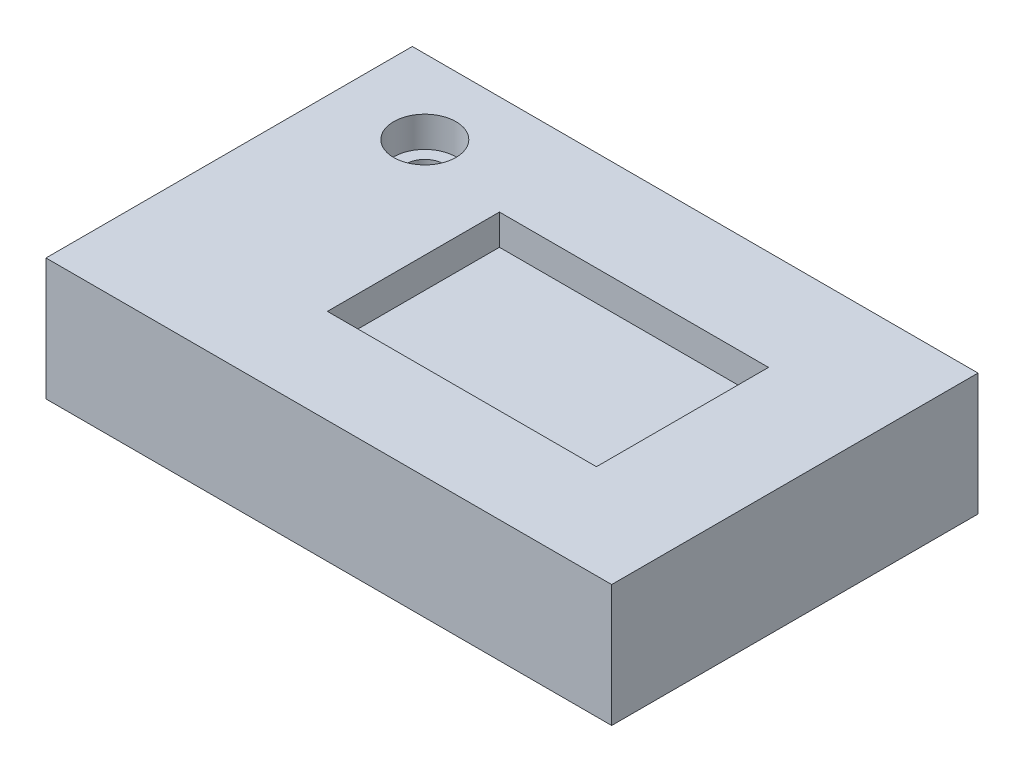
ISO-10303-21;
HEADER;
FILE_DESCRIPTION(('STEP AP214'),'2;1');
FILE_NAME('part.step','',(''),(''),'','','');
FILE_SCHEMA(('AUTOMOTIVE_DESIGN { 1 0 10303 214 1 1 1 1 }'));
ENDSEC;
DATA;
#1=APPLICATION_CONTEXT('core data for automotive mechanical design processes');
#2=APPLICATION_PROTOCOL_DEFINITION('international standard','automotive_design',2000,#1);
#3=PRODUCT_CONTEXT('',#1,'mechanical');
#4=PRODUCT('Part','Part','',(#3));
#5=PRODUCT_RELATED_PRODUCT_CATEGORY('part','',(#4));
#6=PRODUCT_DEFINITION_FORMATION('','',#4);
#7=PRODUCT_DEFINITION_CONTEXT('part definition',#1,'design');
#8=PRODUCT_DEFINITION('design','',#6,#7);
#9=PRODUCT_DEFINITION_SHAPE('','',#8);
#10=(LENGTH_UNIT() NAMED_UNIT(*) SI_UNIT(.MILLI.,.METRE.));
#11=(NAMED_UNIT(*) PLANE_ANGLE_UNIT() SI_UNIT($,.RADIAN.));
#12=(NAMED_UNIT(*) SI_UNIT($,.STERADIAN.) SOLID_ANGLE_UNIT());
#13=UNCERTAINTY_MEASURE_WITH_UNIT(LENGTH_MEASURE(1.E-05),#10,'distance_accuracy_value','');
#14=(GEOMETRIC_REPRESENTATION_CONTEXT(3) GLOBAL_UNCERTAINTY_ASSIGNED_CONTEXT((#13)) GLOBAL_UNIT_ASSIGNED_CONTEXT((#10,
#11,#12)) REPRESENTATION_CONTEXT('',''));
#15=CARTESIAN_POINT('',(0.,0.,0.));
#16=DIRECTION('',(0.,0.,1.));
#17=DIRECTION('',(1.,0.,0.));
#18=AXIS2_PLACEMENT_3D('',#15,#16,#17);
#19=CARTESIAN_POINT('',(0.,50.8,0.));
#20=DIRECTION('',(-1.,0.,0.));
#21=DIRECTION('',(0.,0.,1.));
#22=AXIS2_PLACEMENT_3D('',#19,#20,#21);
#23=PLANE('',#22);
#24=DIRECTION('',(0.,0.,-1.));
#25=VECTOR('',#24,1.);
#26=CARTESIAN_POINT('',(0.,0.,0.));
#27=LINE('',#26,#25);
#28=CARTESIAN_POINT('',(0.,0.,0.));
#29=VERTEX_POINT('',#28);
#30=CARTESIAN_POINT('',(0.,0.,-152.4));
#31=VERTEX_POINT('',#30);
#32=EDGE_CURVE('E11',#29,#31,#27,.T.);
#33=ORIENTED_EDGE('',*,*,#32,.T.);
#34=DIRECTION('',(0.,-1.,0.));
#35=VECTOR('',#34,1.);
#36=CARTESIAN_POINT('',(0.,50.8,-152.4));
#37=LINE('',#36,#35);
#38=CARTESIAN_POINT('',(0.,50.8,-152.4));
#39=VERTEX_POINT('',#38);
#40=EDGE_CURVE('E36',#39,#31,#37,.T.);
#41=ORIENTED_EDGE('',*,*,#40,.F.);
#42=DIRECTION('',(0.,0.,-1.));
#43=VECTOR('',#42,1.);
#44=CARTESIAN_POINT('',(0.,50.8,0.));
#45=LINE('',#44,#43);
#46=CARTESIAN_POINT('',(0.,50.8,0.));
#47=VERTEX_POINT('',#46);
#48=EDGE_CURVE('E148',#47,#39,#45,.T.);
#49=ORIENTED_EDGE('',*,*,#48,.F.);
#50=DIRECTION('',(0.,-1.,0.));
#51=VECTOR('',#50,1.);
#52=CARTESIAN_POINT('',(0.,50.8,0.));
#53=LINE('',#52,#51);
#54=EDGE_CURVE('E27',#47,#29,#53,.T.);
#55=ORIENTED_EDGE('',*,*,#54,.T.);
#56=EDGE_LOOP('',(#33,#41,#49,#55));
#57=FACE_BOUND('',#56,.T.);
#58=ADVANCED_FACE('F17',(#57),#23,.F.);
#59=CARTESIAN_POINT('',(0.,50.8,-152.4));
#60=DIRECTION('',(0.,0.,1.));
#61=DIRECTION('',(1.,0.,0.));
#62=AXIS2_PLACEMENT_3D('',#59,#60,#61);
#63=PLANE('',#62);
#64=DIRECTION('',(-1.,0.,0.));
#65=VECTOR('',#64,1.);
#66=CARTESIAN_POINT('',(0.,0.,-152.4));
#67=LINE('',#66,#65);
#68=CARTESIAN_POINT('',(-235.333910709721,0.,-152.4));
#69=VERTEX_POINT('',#68);
#70=EDGE_CURVE('E154',#31,#69,#67,.T.);
#71=ORIENTED_EDGE('',*,*,#70,.T.);
#72=DIRECTION('',(0.,-1.,0.));
#73=VECTOR('',#72,1.);
#74=CARTESIAN_POINT('',(-235.333910709721,50.8,-152.4));
#75=LINE('',#74,#73);
#76=CARTESIAN_POINT('',(-235.333910709721,50.8,-152.4));
#77=VERTEX_POINT('',#76);
#78=EDGE_CURVE('E143',#77,#69,#75,.T.);
#79=ORIENTED_EDGE('',*,*,#78,.F.);
#80=DIRECTION('',(-1.,0.,0.));
#81=VECTOR('',#80,1.);
#82=CARTESIAN_POINT('',(0.,50.8,-152.4));
#83=LINE('',#82,#81);
#84=EDGE_CURVE('E146',#39,#77,#83,.T.);
#85=ORIENTED_EDGE('',*,*,#84,.F.);
#86=ORIENTED_EDGE('',*,*,#40,.T.);
#87=EDGE_LOOP('',(#71,#79,#85,#86));
#88=FACE_BOUND('',#87,.T.);
#89=ADVANCED_FACE('F167',(#88),#63,.F.);
#90=CARTESIAN_POINT('',(-235.333910709721,50.8,0.));
#91=DIRECTION('',(1.,0.,0.));
#92=DIRECTION('',(0.,0.,-1.));
#93=AXIS2_PLACEMENT_3D('',#90,#91,#92);
#94=PLANE('',#93);
#95=DIRECTION('',(0.,0.,1.));
#96=VECTOR('',#95,1.);
#97=CARTESIAN_POINT('',(-235.333910709721,0.,0.));
#98=LINE('',#97,#96);
#99=CARTESIAN_POINT('',(-235.333910709721,0.,0.));
#100=VERTEX_POINT('',#99);
#101=EDGE_CURVE('E149',#69,#100,#98,.T.);
#102=ORIENTED_EDGE('',*,*,#101,.T.);
#103=DIRECTION('',(0.,-1.,0.));
#104=VECTOR('',#103,1.);
#105=CARTESIAN_POINT('',(-235.333910709721,50.8,0.));
#106=LINE('',#105,#104);
#107=CARTESIAN_POINT('',(-235.333910709721,50.8,0.));
#108=VERTEX_POINT('',#107);
#109=EDGE_CURVE('E144',#108,#100,#106,.T.);
#110=ORIENTED_EDGE('',*,*,#109,.F.);
#111=DIRECTION('',(0.,0.,1.));
#112=VECTOR('',#111,1.);
#113=CARTESIAN_POINT('',(-235.333910709721,50.8,0.));
#114=LINE('',#113,#112);
#115=EDGE_CURVE('E139',#77,#108,#114,.T.);
#116=ORIENTED_EDGE('',*,*,#115,.F.);
#117=ORIENTED_EDGE('',*,*,#78,.T.);
#118=EDGE_LOOP('',(#102,#110,#116,#117));
#119=FACE_BOUND('',#118,.T.);
#120=ADVANCED_FACE('F172',(#119),#94,.F.);
#121=CARTESIAN_POINT('',(0.,50.8,0.));
#122=DIRECTION('',(0.,0.,-1.));
#123=DIRECTION('',(-1.,0.,0.));
#124=AXIS2_PLACEMENT_3D('',#121,#122,#123);
#125=PLANE('',#124);
#126=DIRECTION('',(1.,0.,0.));
#127=VECTOR('',#126,1.);
#128=CARTESIAN_POINT('',(0.,0.,0.));
#129=LINE('',#128,#127);
#130=EDGE_CURVE('E140',#100,#29,#129,.T.);
#131=ORIENTED_EDGE('',*,*,#130,.T.);
#132=ORIENTED_EDGE('',*,*,#54,.F.);
#133=DIRECTION('',(1.,0.,0.));
#134=VECTOR('',#133,1.);
#135=CARTESIAN_POINT('',(0.,50.8,0.));
#136=LINE('',#135,#134);
#137=EDGE_CURVE('E127',#108,#47,#136,.T.);
#138=ORIENTED_EDGE('',*,*,#137,.F.);
#139=ORIENTED_EDGE('',*,*,#109,.T.);
#140=EDGE_LOOP('',(#131,#132,#138,#139));
#141=FACE_BOUND('',#140,.T.);
#142=ADVANCED_FACE('F175',(#141),#125,.F.);
#143=CARTESIAN_POINT('',(0.,50.8,0.));
#144=DIRECTION('',(0.,1.,0.));
#145=DIRECTION('',(0.,0.,1.));
#146=AXIS2_PLACEMENT_3D('',#143,#144,#145);
#147=PLANE('',#146);
#148=DIRECTION('',(0.,0.,1.));
#149=VECTOR('',#148,1.);
#150=CARTESIAN_POINT('',(-157.558145589306,50.8,-110.862547575607));
#151=LINE('',#150,#149);
#152=CARTESIAN_POINT('',(-157.558145589306,50.8,-110.862547575607));
#153=VERTEX_POINT('',#152);
#154=CARTESIAN_POINT('',(-157.558145589306,50.8,-39.2851410991852));
#155=VERTEX_POINT('',#154);
#156=EDGE_CURVE('E111',#153,#155,#151,.T.);
#157=ORIENTED_EDGE('',*,*,#156,.F.);
#158=DIRECTION('',(-1.,0.,0.));
#159=VECTOR('',#158,1.);
#160=CARTESIAN_POINT('',(-157.558145589306,50.8,-110.862547575607));
#161=LINE('',#160,#159);
#162=CARTESIAN_POINT('',(-45.6210948234173,50.8,-110.862547575607));
#163=VERTEX_POINT('',#162);
#164=EDGE_CURVE('E112',#163,#153,#161,.T.);
#165=ORIENTED_EDGE('',*,*,#164,.F.);
#166=DIRECTION('',(0.,0.,-1.));
#167=VECTOR('',#166,1.);
#168=CARTESIAN_POINT('',(-45.6210948234173,50.8,-110.862547575607));
#169=LINE('',#168,#167);
#170=CARTESIAN_POINT('',(-45.6210948234173,50.8,-39.2851410991852));
#171=VERTEX_POINT('',#170);
#172=EDGE_CURVE('E100',#171,#163,#169,.T.);
#173=ORIENTED_EDGE('',*,*,#172,.F.);
#174=DIRECTION('',(1.,0.,0.));
#175=VECTOR('',#174,1.);
#176=CARTESIAN_POINT('',(-157.558145589306,50.8,-39.2851410991852));
#177=LINE('',#176,#175);
#178=EDGE_CURVE('E98',#155,#171,#177,.T.);
#179=ORIENTED_EDGE('',*,*,#178,.F.);
#180=EDGE_LOOP('',(#157,#165,#173,#179));
#181=FACE_BOUND('',#180,.T.);
#182=CARTESIAN_POINT('',(-199.194063015892,50.8,-121.455863844491));
#183=DIRECTION('',(0.,1.,0.));
#184=DIRECTION('',(0.,0.,1.));
#185=AXIS2_PLACEMENT_3D('',#182,#183,#184);
#186=CIRCLE('',#185,12.9478866365142);
#187=CARTESIAN_POINT('',(-199.194063015892,50.8,-108.507977207977));
#188=VERTEX_POINT('',#187);
#189=EDGE_CURVE('E120',#188,#188,#186,.T.);
#190=ORIENTED_EDGE('',*,*,#189,.F.);
#191=EDGE_LOOP('',(#190));
#192=FACE_BOUND('',#191,.T.);
#193=ORIENTED_EDGE('',*,*,#48,.T.);
#194=ORIENTED_EDGE('',*,*,#84,.T.);
#195=ORIENTED_EDGE('',*,*,#115,.T.);
#196=ORIENTED_EDGE('',*,*,#137,.T.);
#197=EDGE_LOOP('',(#193,#194,#195,#196));
#198=FACE_BOUND('',#197,.T.);
#199=ADVANCED_FACE('F160',(#181,#192,#198),#147,.T.);
#200=CARTESIAN_POINT('',(0.,0.,0.));
#201=DIRECTION('',(0.,1.,0.));
#202=DIRECTION('',(0.,0.,1.));
#203=AXIS2_PLACEMENT_3D('',#200,#201,#202);
#204=PLANE('',#203);
#205=CARTESIAN_POINT('',(-199.194063015892,0.,-121.455863844491));
#206=DIRECTION('',(0.,1.,0.));
#207=DIRECTION('',(0.,0.,1.));
#208=AXIS2_PLACEMENT_3D('',#205,#206,#207);
#209=CIRCLE('',#208,7.86788663651422);
#210=CARTESIAN_POINT('',(-199.194063015892,0.,-113.587977207977));
#211=VERTEX_POINT('',#210);
#212=EDGE_CURVE('E123',#211,#211,#209,.T.);
#213=ORIENTED_EDGE('',*,*,#212,.T.);
#214=EDGE_LOOP('',(#213));
#215=FACE_BOUND('',#214,.T.);
#216=ORIENTED_EDGE('',*,*,#32,.F.);
#217=ORIENTED_EDGE('',*,*,#130,.F.);
#218=ORIENTED_EDGE('',*,*,#101,.F.);
#219=ORIENTED_EDGE('',*,*,#70,.F.);
#220=EDGE_LOOP('',(#216,#217,#218,#219));
#221=FACE_BOUND('',#220,.T.);
#222=ADVANCED_FACE('F177',(#215,#221),#204,.F.);
#223=CARTESIAN_POINT('',(-199.194063015892,38.1,-121.455863844491));
#224=DIRECTION('',(0.,1.,0.));
#225=DIRECTION('',(0.,0.,1.));
#226=AXIS2_PLACEMENT_3D('',#223,#224,#225);
#227=CYLINDRICAL_SURFACE('',#226,12.9478866365142);
#228=CARTESIAN_POINT('',(-199.194063015892,38.1,-121.455863844491));
#229=DIRECTION('',(0.,1.,0.));
#230=DIRECTION('',(0.,0.,1.));
#231=AXIS2_PLACEMENT_3D('',#228,#229,#230);
#232=CIRCLE('',#231,12.9478866365142);
#233=CARTESIAN_POINT('',(-199.194063015892,38.1,-108.507977207977));
#234=VERTEX_POINT('',#233);
#235=EDGE_CURVE('E124',#234,#234,#232,.T.);
#236=ORIENTED_EDGE('',*,*,#235,.F.);
#237=EDGE_LOOP('',(#236));
#238=FACE_BOUND('',#237,.T.);
#239=ORIENTED_EDGE('',*,*,#189,.T.);
#240=EDGE_LOOP('',(#239));
#241=FACE_BOUND('',#240,.T.);
#242=ADVANCED_FACE('F179',(#238,#241),#227,.F.);
#243=CARTESIAN_POINT('',(-199.194063015892,38.1,-121.455863844491));
#244=DIRECTION('',(0.,1.,0.));
#245=DIRECTION('',(0.,0.,1.));
#246=AXIS2_PLACEMENT_3D('',#243,#244,#245);
#247=PLANE('',#246);
#248=CARTESIAN_POINT('',(-199.194063015892,38.1,-121.455863844491));
#249=DIRECTION('',(0.,1.,0.));
#250=DIRECTION('',(0.,0.,1.));
#251=AXIS2_PLACEMENT_3D('',#248,#249,#250);
#252=CIRCLE('',#251,7.86788663651422);
#253=CARTESIAN_POINT('',(-199.194063015892,38.1,-113.587977207977));
#254=VERTEX_POINT('',#253);
#255=EDGE_CURVE('E129',#254,#254,#252,.T.);
#256=ORIENTED_EDGE('',*,*,#255,.F.);
#257=EDGE_LOOP('',(#256));
#258=FACE_BOUND('',#257,.T.);
#259=ORIENTED_EDGE('',*,*,#235,.T.);
#260=EDGE_LOOP('',(#259));
#261=FACE_BOUND('',#260,.T.);
#262=ADVANCED_FACE('F187',(#258,#261),#247,.T.);
#263=CARTESIAN_POINT('',(-199.194063015892,0.,-121.455863844491));
#264=DIRECTION('',(0.,1.,0.));
#265=DIRECTION('',(0.,0.,1.));
#266=AXIS2_PLACEMENT_3D('',#263,#264,#265);
#267=CYLINDRICAL_SURFACE('',#266,7.86788663651422);
#268=ORIENTED_EDGE('',*,*,#212,.F.);
#269=EDGE_LOOP('',(#268));
#270=FACE_BOUND('',#269,.T.);
#271=ORIENTED_EDGE('',*,*,#255,.T.);
#272=EDGE_LOOP('',(#271));
#273=FACE_BOUND('',#272,.T.);
#274=ADVANCED_FACE('F234',(#270,#273),#267,.F.);
#275=CARTESIAN_POINT('',(-157.558145589306,38.1,-110.862547575607));
#276=DIRECTION('',(-1.,0.,0.));
#277=DIRECTION('',(0.,0.,1.));
#278=AXIS2_PLACEMENT_3D('',#275,#276,#277);
#279=PLANE('',#278);
#280=ORIENTED_EDGE('',*,*,#156,.T.);
#281=DIRECTION('',(0.,1.,0.));
#282=VECTOR('',#281,1.);
#283=CARTESIAN_POINT('',(-157.558145589306,38.1,-39.2851410991852));
#284=LINE('',#283,#282);
#285=CARTESIAN_POINT('',(-157.558145589306,38.1,-39.2851410991852));
#286=VERTEX_POINT('',#285);
#287=EDGE_CURVE('E103',#286,#155,#284,.T.);
#288=ORIENTED_EDGE('',*,*,#287,.F.);
#289=DIRECTION('',(0.,0.,1.));
#290=VECTOR('',#289,1.);
#291=CARTESIAN_POINT('',(-157.558145589306,38.1,-110.862547575607));
#292=LINE('',#291,#290);
#293=CARTESIAN_POINT('',(-157.558145589306,38.1,-110.862547575607));
#294=VERTEX_POINT('',#293);
#295=EDGE_CURVE('E101',#294,#286,#292,.T.);
#296=ORIENTED_EDGE('',*,*,#295,.F.);
#297=DIRECTION('',(0.,1.,0.));
#298=VECTOR('',#297,1.);
#299=CARTESIAN_POINT('',(-157.558145589306,38.1,-110.862547575607));
#300=LINE('',#299,#298);
#301=EDGE_CURVE('E108',#294,#153,#300,.T.);
#302=ORIENTED_EDGE('',*,*,#301,.T.);
#303=EDGE_LOOP('',(#280,#288,#296,#302));
#304=FACE_BOUND('',#303,.T.);
#305=ADVANCED_FACE('F244',(#304),#279,.F.);
#306=CARTESIAN_POINT('',(-157.558145589306,38.1,-110.862547575607));
#307=DIRECTION('',(0.,0.,-1.));
#308=DIRECTION('',(-1.,0.,0.));
#309=AXIS2_PLACEMENT_3D('',#306,#307,#308);
#310=PLANE('',#309);
#311=ORIENTED_EDGE('',*,*,#164,.T.);
#312=ORIENTED_EDGE('',*,*,#301,.F.);
#313=DIRECTION('',(-1.,0.,0.));
#314=VECTOR('',#313,1.);
#315=CARTESIAN_POINT('',(-157.558145589306,38.1,-110.862547575607));
#316=LINE('',#315,#314);
#317=CARTESIAN_POINT('',(-45.6210948234173,38.1,-110.862547575607));
#318=VERTEX_POINT('',#317);
#319=EDGE_CURVE('E80',#318,#294,#316,.T.);
#320=ORIENTED_EDGE('',*,*,#319,.F.);
#321=DIRECTION('',(0.,1.,0.));
#322=VECTOR('',#321,1.);
#323=CARTESIAN_POINT('',(-45.6210948234173,38.1,-110.862547575607));
#324=LINE('',#323,#322);
#325=EDGE_CURVE('E90',#318,#163,#324,.T.);
#326=ORIENTED_EDGE('',*,*,#325,.T.);
#327=EDGE_LOOP('',(#311,#312,#320,#326));
#328=FACE_BOUND('',#327,.T.);
#329=ADVANCED_FACE('F254',(#328),#310,.F.);
#330=CARTESIAN_POINT('',(-45.6210948234173,38.1,-110.862547575607));
#331=DIRECTION('',(1.,0.,0.));
#332=DIRECTION('',(0.,0.,-1.));
#333=AXIS2_PLACEMENT_3D('',#330,#331,#332);
#334=PLANE('',#333);
#335=ORIENTED_EDGE('',*,*,#172,.T.);
#336=ORIENTED_EDGE('',*,*,#325,.F.);
#337=DIRECTION('',(0.,0.,-1.));
#338=VECTOR('',#337,1.);
#339=CARTESIAN_POINT('',(-45.6210948234173,38.1,-110.862547575607));
#340=LINE('',#339,#338);
#341=CARTESIAN_POINT('',(-45.6210948234173,38.1,-39.2851410991852));
#342=VERTEX_POINT('',#341);
#343=EDGE_CURVE('E86',#342,#318,#340,.T.);
#344=ORIENTED_EDGE('',*,*,#343,.F.);
#345=DIRECTION('',(0.,1.,0.));
#346=VECTOR('',#345,1.);
#347=CARTESIAN_POINT('',(-45.6210948234173,38.1,-39.2851410991852));
#348=LINE('',#347,#346);
#349=EDGE_CURVE('E89',#342,#171,#348,.T.);
#350=ORIENTED_EDGE('',*,*,#349,.T.);
#351=EDGE_LOOP('',(#335,#336,#344,#350));
#352=FACE_BOUND('',#351,.T.);
#353=ADVANCED_FACE('F88',(#352),#334,.F.);
#354=CARTESIAN_POINT('',(-157.558145589306,38.1,-39.2851410991852));
#355=DIRECTION('',(0.,0.,1.));
#356=DIRECTION('',(1.,0.,0.));
#357=AXIS2_PLACEMENT_3D('',#354,#355,#356);
#358=PLANE('',#357);
#359=ORIENTED_EDGE('',*,*,#178,.T.);
#360=ORIENTED_EDGE('',*,*,#349,.F.);
#361=DIRECTION('',(1.,0.,0.));
#362=VECTOR('',#361,1.);
#363=CARTESIAN_POINT('',(-157.558145589306,38.1,-39.2851410991852));
#364=LINE('',#363,#362);
#365=EDGE_CURVE('E21',#286,#342,#364,.T.);
#366=ORIENTED_EDGE('',*,*,#365,.F.);
#367=ORIENTED_EDGE('',*,*,#287,.T.);
#368=EDGE_LOOP('',(#359,#360,#366,#367));
#369=FACE_BOUND('',#368,.T.);
#370=ADVANCED_FACE('F96',(#369),#358,.F.);
#371=CARTESIAN_POINT('',(0.,38.1,0.));
#372=DIRECTION('',(0.,1.,0.));
#373=DIRECTION('',(0.,0.,1.));
#374=AXIS2_PLACEMENT_3D('',#371,#372,#373);
#375=PLANE('',#374);
#376=ORIENTED_EDGE('',*,*,#295,.T.);
#377=ORIENTED_EDGE('',*,*,#365,.T.);
#378=ORIENTED_EDGE('',*,*,#343,.T.);
#379=ORIENTED_EDGE('',*,*,#319,.T.);
#380=EDGE_LOOP('',(#376,#377,#378,#379));
#381=FACE_BOUND('',#380,.T.);
#382=ADVANCED_FACE('F19',(#381),#375,.T.);
#383=CLOSED_SHELL('',(#58,#89,#120,#142,#199,#222,#242,#262,#274,#305,#329,#353,#370,#382));
#384=MANIFOLD_SOLID_BREP('B1',#383);
#385=ADVANCED_BREP_SHAPE_REPRESENTATION('',(#18,#384),#14);
#386=SHAPE_DEFINITION_REPRESENTATION(#9,#385);
ENDSEC;
END-ISO-10303-21;
